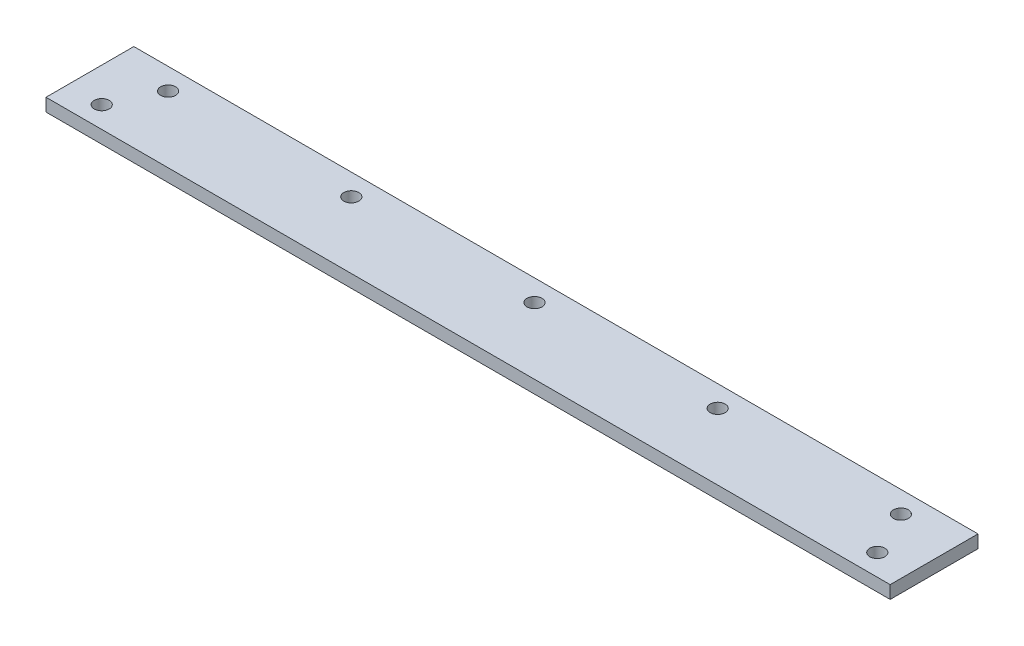
ISO-10303-21;
HEADER;
FILE_DESCRIPTION(('STEP AP214'),'2;1');
FILE_NAME('part.step','',(''),(''),'','','');
FILE_SCHEMA(('AUTOMOTIVE_DESIGN { 1 0 10303 214 1 1 1 1 }'));
ENDSEC;
DATA;
#1=APPLICATION_CONTEXT('core data for automotive mechanical design processes');
#2=APPLICATION_PROTOCOL_DEFINITION('international standard','automotive_design',2000,#1);
#3=PRODUCT_CONTEXT('',#1,'mechanical');
#4=PRODUCT('Part','Part','',(#3));
#5=PRODUCT_RELATED_PRODUCT_CATEGORY('part','',(#4));
#6=PRODUCT_DEFINITION_FORMATION('','',#4);
#7=PRODUCT_DEFINITION_CONTEXT('part definition',#1,'design');
#8=PRODUCT_DEFINITION('design','',#6,#7);
#9=PRODUCT_DEFINITION_SHAPE('','',#8);
#10=(LENGTH_UNIT() NAMED_UNIT(*) SI_UNIT(.MILLI.,.METRE.));
#11=(NAMED_UNIT(*) PLANE_ANGLE_UNIT() SI_UNIT($,.RADIAN.));
#12=(NAMED_UNIT(*) SI_UNIT($,.STERADIAN.) SOLID_ANGLE_UNIT());
#13=UNCERTAINTY_MEASURE_WITH_UNIT(LENGTH_MEASURE(1.E-05),#10,'distance_accuracy_value','');
#14=(GEOMETRIC_REPRESENTATION_CONTEXT(3) GLOBAL_UNCERTAINTY_ASSIGNED_CONTEXT((#13)) GLOBAL_UNIT_ASSIGNED_CONTEXT((#10,
#11,#12)) REPRESENTATION_CONTEXT('',''));
#15=CARTESIAN_POINT('',(0.,0.,0.));
#16=DIRECTION('',(0.,0.,1.));
#17=DIRECTION('',(1.,0.,0.));
#18=AXIS2_PLACEMENT_3D('',#15,#16,#17);
#19=CARTESIAN_POINT('',(0.,0.,0.));
#20=DIRECTION('',(0.,-1.,0.));
#21=DIRECTION('',(0.,0.,-1.));
#22=AXIS2_PLACEMENT_3D('',#19,#20,#21);
#23=PLANE('',#22);
#24=CARTESIAN_POINT('',(141.25,0.,-15.5));
#25=DIRECTION('',(0.,1.,0.));
#26=DIRECTION('',(0.,0.,1.));
#27=AXIS2_PLACEMENT_3D('',#24,#25,#26);
#28=CIRCLE('',#27,1.75);
#29=CARTESIAN_POINT('',(141.25,0.,-13.75));
#30=VERTEX_POINT('',#29);
#31=EDGE_CURVE('E146',#30,#30,#28,.T.);
#32=ORIENTED_EDGE('',*,*,#31,.T.);
#33=EDGE_LOOP('',(#32));
#34=FACE_BOUND('',#33,.T.);
#35=CARTESIAN_POINT('',(55.75,0.,-15.5));
#36=DIRECTION('',(0.,1.,0.));
#37=DIRECTION('',(0.,0.,1.));
#38=AXIS2_PLACEMENT_3D('',#35,#36,#37);
#39=CIRCLE('',#38,1.75000000000002);
#40=CARTESIAN_POINT('',(55.75,0.,-13.75));
#41=VERTEX_POINT('',#40);
#42=EDGE_CURVE('E140',#41,#41,#39,.T.);
#43=ORIENTED_EDGE('',*,*,#42,.T.);
#44=EDGE_LOOP('',(#43));
#45=FACE_BOUND('',#44,.T.);
#46=CARTESIAN_POINT('',(13.,0.,-15.5));
#47=DIRECTION('',(0.,1.,0.));
#48=DIRECTION('',(0.,0.,1.));
#49=AXIS2_PLACEMENT_3D('',#46,#47,#48);
#50=CIRCLE('',#49,1.75000000000001);
#51=CARTESIAN_POINT('',(13.,0.,-13.75));
#52=VERTEX_POINT('',#51);
#53=EDGE_CURVE('E134',#52,#52,#50,.T.);
#54=ORIENTED_EDGE('',*,*,#53,.T.);
#55=EDGE_LOOP('',(#54));
#56=FACE_BOUND('',#55,.T.);
#57=CARTESIAN_POINT('',(184.,0.,-15.5));
#58=DIRECTION('',(0.,1.,0.));
#59=DIRECTION('',(0.,0.,1.));
#60=AXIS2_PLACEMENT_3D('',#57,#58,#59);
#61=CIRCLE('',#60,1.75);
#62=CARTESIAN_POINT('',(184.,0.,-13.75));
#63=VERTEX_POINT('',#62);
#64=EDGE_CURVE('E128',#63,#63,#61,.T.);
#65=ORIENTED_EDGE('',*,*,#64,.T.);
#66=EDGE_LOOP('',(#65));
#67=FACE_BOUND('',#66,.T.);
#68=CARTESIAN_POINT('',(8.,0.,-5.));
#69=DIRECTION('',(0.,1.,0.));
#70=DIRECTION('',(0.,0.,1.));
#71=AXIS2_PLACEMENT_3D('',#68,#69,#70);
#72=CIRCLE('',#71,1.75000000000001);
#73=CARTESIAN_POINT('',(8.,0.,-3.24999999999999));
#74=VERTEX_POINT('',#73);
#75=EDGE_CURVE('E122',#74,#74,#72,.T.);
#76=ORIENTED_EDGE('',*,*,#75,.T.);
#77=EDGE_LOOP('',(#76));
#78=FACE_BOUND('',#77,.T.);
#79=CARTESIAN_POINT('',(189.,0.,-5.));
#80=DIRECTION('',(0.,1.,0.));
#81=DIRECTION('',(0.,0.,1.));
#82=AXIS2_PLACEMENT_3D('',#79,#80,#81);
#83=CIRCLE('',#82,1.75);
#84=CARTESIAN_POINT('',(189.,0.,-3.25));
#85=VERTEX_POINT('',#84);
#86=EDGE_CURVE('E106',#85,#85,#83,.T.);
#87=ORIENTED_EDGE('',*,*,#86,.T.);
#88=EDGE_LOOP('',(#87));
#89=FACE_BOUND('',#88,.T.);
#90=DIRECTION('',(0.,0.,1.));
#91=VECTOR('',#90,1.);
#92=CARTESIAN_POINT('',(0.,0.,0.));
#93=LINE('',#92,#91);
#94=CARTESIAN_POINT('',(0.,0.,-20.5));
#95=VERTEX_POINT('',#94);
#96=CARTESIAN_POINT('',(0.,0.,0.));
#97=VERTEX_POINT('',#96);
#98=EDGE_CURVE('E103',#95,#97,#93,.T.);
#99=ORIENTED_EDGE('',*,*,#98,.F.);
#100=DIRECTION('',(-1.,0.,0.));
#101=VECTOR('',#100,1.);
#102=CARTESIAN_POINT('',(0.,0.,-20.5));
#103=LINE('',#102,#101);
#104=CARTESIAN_POINT('',(197.,0.,-20.5));
#105=VERTEX_POINT('',#104);
#106=EDGE_CURVE('E79',#105,#95,#103,.T.);
#107=ORIENTED_EDGE('',*,*,#106,.F.);
#108=DIRECTION('',(0.,0.,-1.));
#109=VECTOR('',#108,1.);
#110=CARTESIAN_POINT('',(197.,0.,0.));
#111=LINE('',#110,#109);
#112=CARTESIAN_POINT('',(197.,0.,0.));
#113=VERTEX_POINT('',#112);
#114=EDGE_CURVE('E73',#113,#105,#111,.T.);
#115=ORIENTED_EDGE('',*,*,#114,.F.);
#116=DIRECTION('',(1.,0.,0.));
#117=VECTOR('',#116,1.);
#118=CARTESIAN_POINT('',(0.,0.,0.));
#119=LINE('',#118,#117);
#120=EDGE_CURVE('E95',#97,#113,#119,.T.);
#121=ORIENTED_EDGE('',*,*,#120,.F.);
#122=EDGE_LOOP('',(#99,#107,#115,#121));
#123=FACE_BOUND('',#122,.T.);
#124=CARTESIAN_POINT('',(98.5,0.,-15.5));
#125=DIRECTION('',(0.,1.,0.));
#126=DIRECTION('',(0.,0.,1.));
#127=AXIS2_PLACEMENT_3D('',#124,#125,#126);
#128=CIRCLE('',#127,1.75000000000002);
#129=CARTESIAN_POINT('',(98.5,0.,-13.75));
#130=VERTEX_POINT('',#129);
#131=EDGE_CURVE('E152',#130,#130,#128,.T.);
#132=ORIENTED_EDGE('',*,*,#131,.T.);
#133=EDGE_LOOP('',(#132));
#134=FACE_BOUND('',#133,.T.);
#135=ADVANCED_FACE('F39',(#34,#45,#56,#67,#78,#89,#123,#134),#23,.T.);
#136=CARTESIAN_POINT('',(0.,3.,0.));
#137=DIRECTION('',(1.,0.,0.));
#138=DIRECTION('',(0.,0.,-1.));
#139=AXIS2_PLACEMENT_3D('',#136,#137,#138);
#140=PLANE('',#139);
#141=ORIENTED_EDGE('',*,*,#98,.T.);
#142=DIRECTION('',(0.,-1.,0.));
#143=VECTOR('',#142,1.);
#144=CARTESIAN_POINT('',(0.,3.,0.));
#145=LINE('',#144,#143);
#146=CARTESIAN_POINT('',(0.,3.,0.));
#147=VERTEX_POINT('',#146);
#148=EDGE_CURVE('E11',#147,#97,#145,.T.);
#149=ORIENTED_EDGE('',*,*,#148,.F.);
#150=DIRECTION('',(0.,0.,1.));
#151=VECTOR('',#150,1.);
#152=CARTESIAN_POINT('',(0.,3.,0.));
#153=LINE('',#152,#151);
#154=CARTESIAN_POINT('',(0.,3.,-20.5));
#155=VERTEX_POINT('',#154);
#156=EDGE_CURVE('E91',#155,#147,#153,.T.);
#157=ORIENTED_EDGE('',*,*,#156,.F.);
#158=DIRECTION('',(0.,-1.,0.));
#159=VECTOR('',#158,1.);
#160=CARTESIAN_POINT('',(0.,3.,-20.5));
#161=LINE('',#160,#159);
#162=EDGE_CURVE('E99',#155,#95,#161,.T.);
#163=ORIENTED_EDGE('',*,*,#162,.T.);
#164=EDGE_LOOP('',(#141,#149,#157,#163));
#165=FACE_BOUND('',#164,.T.);
#166=ADVANCED_FACE('F41',(#165),#140,.F.);
#167=CARTESIAN_POINT('',(0.,3.,0.));
#168=DIRECTION('',(0.,0.,-1.));
#169=DIRECTION('',(-1.,0.,0.));
#170=AXIS2_PLACEMENT_3D('',#167,#168,#169);
#171=PLANE('',#170);
#172=ORIENTED_EDGE('',*,*,#120,.T.);
#173=DIRECTION('',(0.,-1.,0.));
#174=VECTOR('',#173,1.);
#175=CARTESIAN_POINT('',(197.,3.,0.));
#176=LINE('',#175,#174);
#177=CARTESIAN_POINT('',(197.,3.,0.));
#178=VERTEX_POINT('',#177);
#179=EDGE_CURVE('E48',#178,#113,#176,.T.);
#180=ORIENTED_EDGE('',*,*,#179,.F.);
#181=DIRECTION('',(1.,0.,0.));
#182=VECTOR('',#181,1.);
#183=CARTESIAN_POINT('',(0.,3.,0.));
#184=LINE('',#183,#182);
#185=EDGE_CURVE('E86',#147,#178,#184,.T.);
#186=ORIENTED_EDGE('',*,*,#185,.F.);
#187=ORIENTED_EDGE('',*,*,#148,.T.);
#188=EDGE_LOOP('',(#172,#180,#186,#187));
#189=FACE_BOUND('',#188,.T.);
#190=ADVANCED_FACE('F94',(#189),#171,.F.);
#191=CARTESIAN_POINT('',(197.,3.,0.));
#192=DIRECTION('',(-1.,0.,0.));
#193=DIRECTION('',(0.,0.,1.));
#194=AXIS2_PLACEMENT_3D('',#191,#192,#193);
#195=PLANE('',#194);
#196=ORIENTED_EDGE('',*,*,#114,.T.);
#197=DIRECTION('',(0.,-1.,0.));
#198=VECTOR('',#197,1.);
#199=CARTESIAN_POINT('',(197.,3.,-20.5));
#200=LINE('',#199,#198);
#201=CARTESIAN_POINT('',(197.,3.,-20.5));
#202=VERTEX_POINT('',#201);
#203=EDGE_CURVE('E96',#202,#105,#200,.T.);
#204=ORIENTED_EDGE('',*,*,#203,.F.);
#205=DIRECTION('',(0.,0.,-1.));
#206=VECTOR('',#205,1.);
#207=CARTESIAN_POINT('',(197.,3.,0.));
#208=LINE('',#207,#206);
#209=EDGE_CURVE('E89',#178,#202,#208,.T.);
#210=ORIENTED_EDGE('',*,*,#209,.F.);
#211=ORIENTED_EDGE('',*,*,#179,.T.);
#212=EDGE_LOOP('',(#196,#204,#210,#211));
#213=FACE_BOUND('',#212,.T.);
#214=ADVANCED_FACE('F97',(#213),#195,.F.);
#215=CARTESIAN_POINT('',(0.,3.,-20.5));
#216=DIRECTION('',(0.,0.,1.));
#217=DIRECTION('',(1.,0.,0.));
#218=AXIS2_PLACEMENT_3D('',#215,#216,#217);
#219=PLANE('',#218);
#220=ORIENTED_EDGE('',*,*,#106,.T.);
#221=ORIENTED_EDGE('',*,*,#162,.F.);
#222=DIRECTION('',(-1.,0.,0.));
#223=VECTOR('',#222,1.);
#224=CARTESIAN_POINT('',(0.,3.,-20.5));
#225=LINE('',#224,#223);
#226=EDGE_CURVE('E56',#202,#155,#225,.T.);
#227=ORIENTED_EDGE('',*,*,#226,.F.);
#228=ORIENTED_EDGE('',*,*,#203,.T.);
#229=EDGE_LOOP('',(#220,#221,#227,#228));
#230=FACE_BOUND('',#229,.T.);
#231=ADVANCED_FACE('F111',(#230),#219,.F.);
#232=CARTESIAN_POINT('',(0.,3.,0.));
#233=DIRECTION('',(0.,-1.,0.));
#234=DIRECTION('',(0.,0.,-1.));
#235=AXIS2_PLACEMENT_3D('',#232,#233,#234);
#236=PLANE('',#235);
#237=CARTESIAN_POINT('',(98.5,3.,-15.5));
#238=DIRECTION('',(0.,1.,0.));
#239=DIRECTION('',(0.,0.,1.));
#240=AXIS2_PLACEMENT_3D('',#237,#238,#239);
#241=CIRCLE('',#240,1.75000000000002);
#242=CARTESIAN_POINT('',(98.5,3.,-13.75));
#243=VERTEX_POINT('',#242);
#244=EDGE_CURVE('E155',#243,#243,#241,.T.);
#245=ORIENTED_EDGE('',*,*,#244,.F.);
#246=EDGE_LOOP('',(#245));
#247=FACE_BOUND('',#246,.T.);
#248=CARTESIAN_POINT('',(141.25,3.,-15.5));
#249=DIRECTION('',(0.,1.,0.));
#250=DIRECTION('',(0.,0.,1.));
#251=AXIS2_PLACEMENT_3D('',#248,#249,#250);
#252=CIRCLE('',#251,1.75);
#253=CARTESIAN_POINT('',(141.25,3.,-13.75));
#254=VERTEX_POINT('',#253);
#255=EDGE_CURVE('E149',#254,#254,#252,.T.);
#256=ORIENTED_EDGE('',*,*,#255,.F.);
#257=EDGE_LOOP('',(#256));
#258=FACE_BOUND('',#257,.T.);
#259=CARTESIAN_POINT('',(55.75,3.,-15.5));
#260=DIRECTION('',(0.,1.,0.));
#261=DIRECTION('',(0.,0.,1.));
#262=AXIS2_PLACEMENT_3D('',#259,#260,#261);
#263=CIRCLE('',#262,1.75000000000002);
#264=CARTESIAN_POINT('',(55.75,3.,-13.75));
#265=VERTEX_POINT('',#264);
#266=EDGE_CURVE('E143',#265,#265,#263,.T.);
#267=ORIENTED_EDGE('',*,*,#266,.F.);
#268=EDGE_LOOP('',(#267));
#269=FACE_BOUND('',#268,.T.);
#270=CARTESIAN_POINT('',(13.,3.,-15.5));
#271=DIRECTION('',(0.,1.,0.));
#272=DIRECTION('',(0.,0.,1.));
#273=AXIS2_PLACEMENT_3D('',#270,#271,#272);
#274=CIRCLE('',#273,1.75000000000001);
#275=CARTESIAN_POINT('',(13.,3.,-13.75));
#276=VERTEX_POINT('',#275);
#277=EDGE_CURVE('E137',#276,#276,#274,.T.);
#278=ORIENTED_EDGE('',*,*,#277,.F.);
#279=EDGE_LOOP('',(#278));
#280=FACE_BOUND('',#279,.T.);
#281=CARTESIAN_POINT('',(184.,3.,-15.5));
#282=DIRECTION('',(0.,1.,0.));
#283=DIRECTION('',(0.,0.,1.));
#284=AXIS2_PLACEMENT_3D('',#281,#282,#283);
#285=CIRCLE('',#284,1.75);
#286=CARTESIAN_POINT('',(184.,3.,-13.75));
#287=VERTEX_POINT('',#286);
#288=EDGE_CURVE('E131',#287,#287,#285,.T.);
#289=ORIENTED_EDGE('',*,*,#288,.F.);
#290=EDGE_LOOP('',(#289));
#291=FACE_BOUND('',#290,.T.);
#292=CARTESIAN_POINT('',(8.,3.,-5.));
#293=DIRECTION('',(0.,1.,0.));
#294=DIRECTION('',(0.,0.,1.));
#295=AXIS2_PLACEMENT_3D('',#292,#293,#294);
#296=CIRCLE('',#295,1.75000000000001);
#297=CARTESIAN_POINT('',(8.,3.,-3.24999999999999));
#298=VERTEX_POINT('',#297);
#299=EDGE_CURVE('E125',#298,#298,#296,.T.);
#300=ORIENTED_EDGE('',*,*,#299,.F.);
#301=EDGE_LOOP('',(#300));
#302=FACE_BOUND('',#301,.T.);
#303=CARTESIAN_POINT('',(189.,3.,-5.));
#304=DIRECTION('',(0.,1.,0.));
#305=DIRECTION('',(0.,0.,1.));
#306=AXIS2_PLACEMENT_3D('',#303,#304,#305);
#307=CIRCLE('',#306,1.75);
#308=CARTESIAN_POINT('',(189.,3.,-3.25));
#309=VERTEX_POINT('',#308);
#310=EDGE_CURVE('E119',#309,#309,#307,.T.);
#311=ORIENTED_EDGE('',*,*,#310,.F.);
#312=EDGE_LOOP('',(#311));
#313=FACE_BOUND('',#312,.T.);
#314=ORIENTED_EDGE('',*,*,#156,.T.);
#315=ORIENTED_EDGE('',*,*,#185,.T.);
#316=ORIENTED_EDGE('',*,*,#209,.T.);
#317=ORIENTED_EDGE('',*,*,#226,.T.);
#318=EDGE_LOOP('',(#314,#315,#316,#317));
#319=FACE_BOUND('',#318,.T.);
#320=ADVANCED_FACE('F87',(#247,#258,#269,#280,#291,#302,#313,#319),#236,.F.);
#321=CARTESIAN_POINT('',(189.,3.,-5.));
#322=DIRECTION('',(0.,1.,0.));
#323=DIRECTION('',(0.,0.,1.));
#324=AXIS2_PLACEMENT_3D('',#321,#322,#323);
#325=CYLINDRICAL_SURFACE('',#324,1.75);
#326=ORIENTED_EDGE('',*,*,#86,.F.);
#327=EDGE_LOOP('',(#326));
#328=FACE_BOUND('',#327,.T.);
#329=ORIENTED_EDGE('',*,*,#310,.T.);
#330=EDGE_LOOP('',(#329));
#331=FACE_BOUND('',#330,.T.);
#332=ADVANCED_FACE('F163',(#328,#331),#325,.F.);
#333=CARTESIAN_POINT('',(8.,3.,-5.));
#334=DIRECTION('',(0.,1.,0.));
#335=DIRECTION('',(0.,0.,1.));
#336=AXIS2_PLACEMENT_3D('',#333,#334,#335);
#337=CYLINDRICAL_SURFACE('',#336,1.75000000000001);
#338=ORIENTED_EDGE('',*,*,#75,.F.);
#339=EDGE_LOOP('',(#338));
#340=FACE_BOUND('',#339,.T.);
#341=ORIENTED_EDGE('',*,*,#299,.T.);
#342=EDGE_LOOP('',(#341));
#343=FACE_BOUND('',#342,.T.);
#344=ADVANCED_FACE('F178',(#340,#343),#337,.F.);
#345=CARTESIAN_POINT('',(184.,3.,-15.5));
#346=DIRECTION('',(0.,1.,0.));
#347=DIRECTION('',(0.,0.,1.));
#348=AXIS2_PLACEMENT_3D('',#345,#346,#347);
#349=CYLINDRICAL_SURFACE('',#348,1.75);
#350=ORIENTED_EDGE('',*,*,#64,.F.);
#351=EDGE_LOOP('',(#350));
#352=FACE_BOUND('',#351,.T.);
#353=ORIENTED_EDGE('',*,*,#288,.T.);
#354=EDGE_LOOP('',(#353));
#355=FACE_BOUND('',#354,.T.);
#356=ADVANCED_FACE('F185',(#352,#355),#349,.F.);
#357=CARTESIAN_POINT('',(13.,3.,-15.5));
#358=DIRECTION('',(0.,1.,0.));
#359=DIRECTION('',(0.,0.,1.));
#360=AXIS2_PLACEMENT_3D('',#357,#358,#359);
#361=CYLINDRICAL_SURFACE('',#360,1.75000000000001);
#362=ORIENTED_EDGE('',*,*,#53,.F.);
#363=EDGE_LOOP('',(#362));
#364=FACE_BOUND('',#363,.T.);
#365=ORIENTED_EDGE('',*,*,#277,.T.);
#366=EDGE_LOOP('',(#365));
#367=FACE_BOUND('',#366,.T.);
#368=ADVANCED_FACE('F244',(#364,#367),#361,.F.);
#369=CARTESIAN_POINT('',(55.75,3.,-15.5));
#370=DIRECTION('',(0.,1.,0.));
#371=DIRECTION('',(0.,0.,1.));
#372=AXIS2_PLACEMENT_3D('',#369,#370,#371);
#373=CYLINDRICAL_SURFACE('',#372,1.75000000000002);
#374=ORIENTED_EDGE('',*,*,#42,.F.);
#375=EDGE_LOOP('',(#374));
#376=FACE_BOUND('',#375,.T.);
#377=ORIENTED_EDGE('',*,*,#266,.T.);
#378=EDGE_LOOP('',(#377));
#379=FACE_BOUND('',#378,.T.);
#380=ADVANCED_FACE('F254',(#376,#379),#373,.F.);
#381=CARTESIAN_POINT('',(141.25,3.,-15.5));
#382=DIRECTION('',(0.,1.,0.));
#383=DIRECTION('',(0.,0.,1.));
#384=AXIS2_PLACEMENT_3D('',#381,#382,#383);
#385=CYLINDRICAL_SURFACE('',#384,1.75);
#386=ORIENTED_EDGE('',*,*,#31,.F.);
#387=EDGE_LOOP('',(#386));
#388=FACE_BOUND('',#387,.T.);
#389=ORIENTED_EDGE('',*,*,#255,.T.);
#390=EDGE_LOOP('',(#389));
#391=FACE_BOUND('',#390,.T.);
#392=ADVANCED_FACE('F264',(#388,#391),#385,.F.);
#393=CARTESIAN_POINT('',(98.5,3.,-15.5));
#394=DIRECTION('',(0.,1.,0.));
#395=DIRECTION('',(0.,0.,1.));
#396=AXIS2_PLACEMENT_3D('',#393,#394,#395);
#397=CYLINDRICAL_SURFACE('',#396,1.75000000000002);
#398=ORIENTED_EDGE('',*,*,#131,.F.);
#399=EDGE_LOOP('',(#398));
#400=FACE_BOUND('',#399,.T.);
#401=ORIENTED_EDGE('',*,*,#244,.T.);
#402=EDGE_LOOP('',(#401));
#403=FACE_BOUND('',#402,.T.);
#404=ADVANCED_FACE('F159',(#400,#403),#397,.F.);
#405=CLOSED_SHELL('',(#135,#166,#190,#214,#231,#320,#332,#344,#356,#368,#380,#392,#404));
#406=MANIFOLD_SOLID_BREP('B2',#405);
#407=ADVANCED_BREP_SHAPE_REPRESENTATION('',(#18,#406),#14);
#408=SHAPE_DEFINITION_REPRESENTATION(#9,#407);
ENDSEC;
END-ISO-10303-21;
